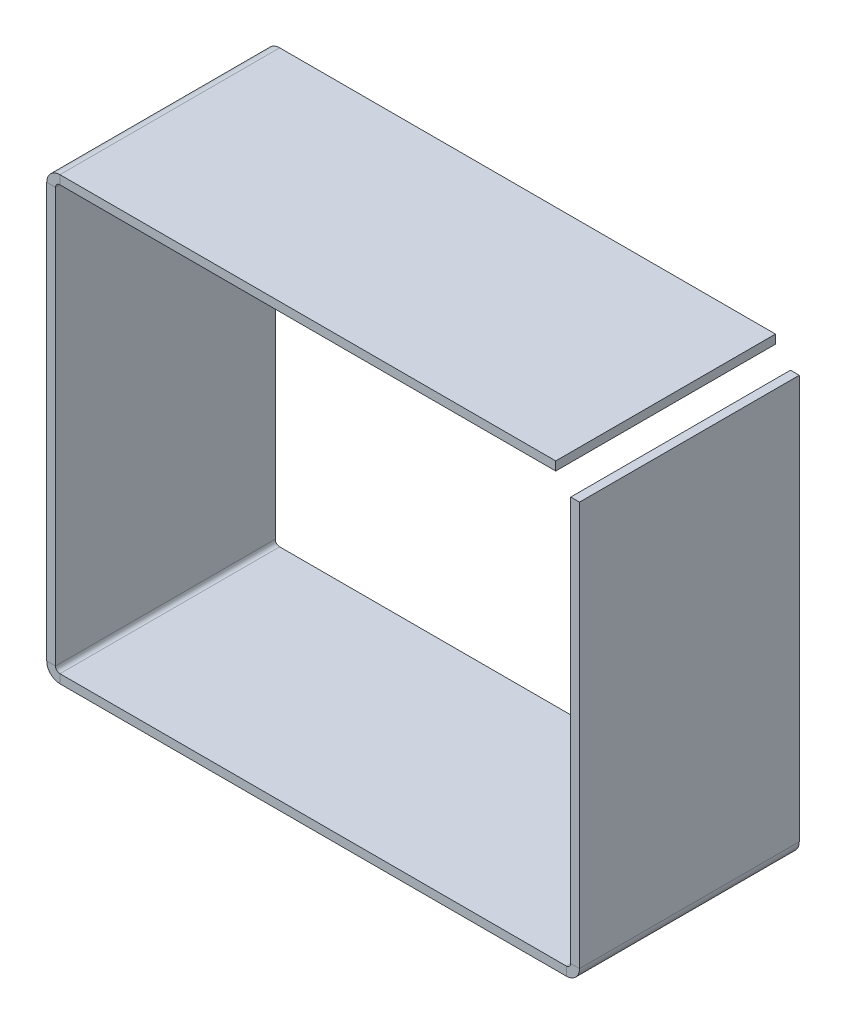
ISO-10303-21;
HEADER;
FILE_DESCRIPTION(('STEP AP214'),'2;1');
FILE_NAME('part.step','',(''),(''),'','','');
FILE_SCHEMA(('AUTOMOTIVE_DESIGN { 1 0 10303 214 1 1 1 1 }'));
ENDSEC;
DATA;
#1=APPLICATION_CONTEXT('core data for automotive mechanical design processes');
#2=APPLICATION_PROTOCOL_DEFINITION('international standard','automotive_design',2000,#1);
#3=PRODUCT_CONTEXT('',#1,'mechanical');
#4=PRODUCT('Part','Part','',(#3));
#5=PRODUCT_RELATED_PRODUCT_CATEGORY('part','',(#4));
#6=PRODUCT_DEFINITION_FORMATION('','',#4);
#7=PRODUCT_DEFINITION_CONTEXT('part definition',#1,'design');
#8=PRODUCT_DEFINITION('design','',#6,#7);
#9=PRODUCT_DEFINITION_SHAPE('','',#8);
#10=(LENGTH_UNIT() NAMED_UNIT(*) SI_UNIT(.MILLI.,.METRE.));
#11=(NAMED_UNIT(*) PLANE_ANGLE_UNIT() SI_UNIT($,.RADIAN.));
#12=(NAMED_UNIT(*) SI_UNIT($,.STERADIAN.) SOLID_ANGLE_UNIT());
#13=UNCERTAINTY_MEASURE_WITH_UNIT(LENGTH_MEASURE(1.E-05),#10,'distance_accuracy_value','');
#14=(GEOMETRIC_REPRESENTATION_CONTEXT(3) GLOBAL_UNCERTAINTY_ASSIGNED_CONTEXT((#13)) GLOBAL_UNIT_ASSIGNED_CONTEXT((#10,
#11,#12)) REPRESENTATION_CONTEXT('',''));
#15=CARTESIAN_POINT('',(0.,0.,0.));
#16=DIRECTION('',(0.,0.,1.));
#17=DIRECTION('',(1.,0.,0.));
#18=AXIS2_PLACEMENT_3D('',#15,#16,#17);
#19=CARTESIAN_POINT('',(-55.4289083851151,46.0431826841211,50.));
#20=DIRECTION('',(0.,0.,-1.));
#21=DIRECTION('',(0.,-1.,0.));
#22=AXIS2_PLACEMENT_3D('',#19,#20,#21);
#23=PLANE('',#22);
#24=DIRECTION('',(1.,0.,0.));
#25=VECTOR('',#24,1.);
#26=CARTESIAN_POINT('',(-55.4289083851151,45.0431826841211,50.));
#27=LINE('',#26,#25);
#28=CARTESIAN_POINT('',(-57.4289083851151,45.0431826841211,50.));
#29=VERTEX_POINT('',#28);
#30=CARTESIAN_POINT('',(-55.4289083851151,45.0431826841211,50.));
#31=VERTEX_POINT('',#30);
#32=EDGE_CURVE('E11',#29,#31,#27,.T.);
#33=ORIENTED_EDGE('',*,*,#32,.F.);
#34=DIRECTION('',(0.,1.,0.));
#35=VECTOR('',#34,1.);
#36=CARTESIAN_POINT('',(-57.4289083851151,46.0431826841211,50.));
#37=LINE('',#36,#35);
#38=CARTESIAN_POINT('',(-57.4289083851151,-49.2933226241939,50.));
#39=VERTEX_POINT('',#38);
#40=EDGE_CURVE('E114',#29,#39,#37,.F.);
#41=ORIENTED_EDGE('',*,*,#40,.T.);
#42=DIRECTION('',(1.,0.,0.));
#43=VECTOR('',#42,1.);
#44=CARTESIAN_POINT('',(-55.4289083851151,-49.2933226241939,50.));
#45=LINE('',#44,#43);
#46=CARTESIAN_POINT('',(-55.4289083851151,-49.2933226241939,50.));
#47=VERTEX_POINT('',#46);
#48=EDGE_CURVE('E50',#39,#47,#45,.T.);
#49=ORIENTED_EDGE('',*,*,#48,.T.);
#50=DIRECTION('',(0.,-1.,0.));
#51=VECTOR('',#50,1.);
#52=CARTESIAN_POINT('',(-55.4289083851151,46.0431826841211,50.));
#53=LINE('',#52,#51);
#54=EDGE_CURVE('E117',#31,#47,#53,.T.);
#55=ORIENTED_EDGE('',*,*,#54,.F.);
#56=EDGE_LOOP('',(#33,#41,#49,#55));
#57=FACE_BOUND('',#56,.T.);
#58=ADVANCED_FACE('F40',(#57),#23,.F.);
#59=CARTESIAN_POINT('',(-54.4289083851151,-49.2933226241939,50.));
#60=DIRECTION('',(0.,0.,1.));
#61=DIRECTION('',(1.,0.,0.));
#62=AXIS2_PLACEMENT_3D('',#59,#60,#61);
#63=PLANE('',#62);
#64=ORIENTED_EDGE('',*,*,#48,.F.);
#65=CARTESIAN_POINT('',(-54.4289083851151,-49.2933226241939,50.));
#66=DIRECTION('',(0.,0.,-1.));
#67=DIRECTION('',(-1.,0.,0.));
#68=AXIS2_PLACEMENT_3D('',#65,#66,#67);
#69=CIRCLE('',#68,3.);
#70=CARTESIAN_POINT('',(-54.4289083851151,-52.2933226241939,50.));
#71=VERTEX_POINT('',#70);
#72=EDGE_CURVE('E156',#39,#71,#69,.F.);
#73=ORIENTED_EDGE('',*,*,#72,.T.);
#74=DIRECTION('',(0.,1.,0.));
#75=VECTOR('',#74,1.);
#76=CARTESIAN_POINT('',(-54.4289083851151,-50.2933226241939,50.));
#77=LINE('',#76,#75);
#78=CARTESIAN_POINT('',(-54.4289083851151,-50.2933226241939,50.));
#79=VERTEX_POINT('',#78);
#80=EDGE_CURVE('E193',#71,#79,#77,.T.);
#81=ORIENTED_EDGE('',*,*,#80,.T.);
#82=CARTESIAN_POINT('',(-54.4289083851151,-49.2933226241939,50.));
#83=DIRECTION('',(0.,0.,-1.));
#84=DIRECTION('',(-1.,0.,0.));
#85=AXIS2_PLACEMENT_3D('',#82,#83,#84);
#86=CIRCLE('',#85,1.);
#87=EDGE_CURVE('E215',#47,#79,#86,.F.);
#88=ORIENTED_EDGE('',*,*,#87,.F.);
#89=EDGE_LOOP('',(#64,#73,#81,#88));
#90=FACE_BOUND('',#89,.T.);
#91=ADVANCED_FACE('F216',(#90),#63,.T.);
#92=CARTESIAN_POINT('',(-55.4289083851151,-50.2933226241939,50.));
#93=DIRECTION('',(0.,0.,-1.));
#94=DIRECTION('',(1.,0.,0.));
#95=AXIS2_PLACEMENT_3D('',#92,#93,#94);
#96=PLANE('',#95);
#97=ORIENTED_EDGE('',*,*,#80,.F.);
#98=DIRECTION('',(1.,0.,0.));
#99=VECTOR('',#98,1.);
#100=CARTESIAN_POINT('',(-55.4289083851151,-52.2933226241939,50.));
#101=LINE('',#100,#99);
#102=CARTESIAN_POINT('',(60.8041182952241,-52.2933226241939,50.));
#103=VERTEX_POINT('',#102);
#104=EDGE_CURVE('E153',#71,#103,#101,.T.);
#105=ORIENTED_EDGE('',*,*,#104,.T.);
#106=DIRECTION('',(0.,1.,0.));
#107=VECTOR('',#106,1.);
#108=CARTESIAN_POINT('',(60.8041182952241,-50.2933226241939,50.));
#109=LINE('',#108,#107);
#110=CARTESIAN_POINT('',(60.8041182952241,-50.2933226241939,50.));
#111=VERTEX_POINT('',#110);
#112=EDGE_CURVE('E58',#103,#111,#109,.T.);
#113=ORIENTED_EDGE('',*,*,#112,.T.);
#114=DIRECTION('',(1.,0.,0.));
#115=VECTOR('',#114,1.);
#116=CARTESIAN_POINT('',(-55.4289083851151,-50.2933226241939,50.));
#117=LINE('',#116,#115);
#118=EDGE_CURVE('E294',#79,#111,#117,.T.);
#119=ORIENTED_EDGE('',*,*,#118,.F.);
#120=EDGE_LOOP('',(#97,#105,#113,#119));
#121=FACE_BOUND('',#120,.T.);
#122=ADVANCED_FACE('F293',(#121),#96,.F.);
#123=CARTESIAN_POINT('',(60.8041182952241,-49.2933226241939,50.));
#124=DIRECTION('',(0.,0.,1.));
#125=DIRECTION('',(1.,0.,0.));
#126=AXIS2_PLACEMENT_3D('',#123,#124,#125);
#127=PLANE('',#126);
#128=ORIENTED_EDGE('',*,*,#112,.F.);
#129=CARTESIAN_POINT('',(60.8041182952241,-49.2933226241939,50.));
#130=DIRECTION('',(0.,0.,-1.));
#131=DIRECTION('',(-1.,0.,0.));
#132=AXIS2_PLACEMENT_3D('',#129,#130,#131);
#133=CIRCLE('',#132,3.);
#134=CARTESIAN_POINT('',(63.8041182952241,-49.2933226241939,50.));
#135=VERTEX_POINT('',#134);
#136=EDGE_CURVE('E274',#103,#135,#133,.F.);
#137=ORIENTED_EDGE('',*,*,#136,.T.);
#138=DIRECTION('',(-1.,0.,0.));
#139=VECTOR('',#138,1.);
#140=CARTESIAN_POINT('',(61.8041182952241,-49.2933226241939,50.));
#141=LINE('',#140,#139);
#142=CARTESIAN_POINT('',(61.8041182952241,-49.2933226241939,50.));
#143=VERTEX_POINT('',#142);
#144=EDGE_CURVE('E189',#135,#143,#141,.T.);
#145=ORIENTED_EDGE('',*,*,#144,.T.);
#146=CARTESIAN_POINT('',(60.8041182952241,-49.2933226241939,50.));
#147=DIRECTION('',(0.,0.,-1.));
#148=DIRECTION('',(-1.,0.,0.));
#149=AXIS2_PLACEMENT_3D('',#146,#147,#148);
#150=CIRCLE('',#149,1.);
#151=EDGE_CURVE('E242',#111,#143,#150,.F.);
#152=ORIENTED_EDGE('',*,*,#151,.F.);
#153=EDGE_LOOP('',(#128,#137,#145,#152));
#154=FACE_BOUND('',#153,.T.);
#155=ADVANCED_FACE('F408',(#154),#127,.T.);
#156=CARTESIAN_POINT('',(61.8041182952241,46.0431826841211,50.));
#157=DIRECTION('',(0.,0.,-1.));
#158=DIRECTION('',(0.,1.,0.));
#159=AXIS2_PLACEMENT_3D('',#156,#157,#158);
#160=PLANE('',#159);
#161=ORIENTED_EDGE('',*,*,#144,.F.);
#162=DIRECTION('',(0.,1.,0.));
#163=VECTOR('',#162,1.);
#164=CARTESIAN_POINT('',(63.8041182952241,46.0431826841211,50.));
#165=LINE('',#164,#163);
#166=CARTESIAN_POINT('',(63.8041182952241,42.628969121748,50.));
#167=VERTEX_POINT('',#166);
#168=EDGE_CURVE('E267',#135,#167,#165,.T.);
#169=ORIENTED_EDGE('',*,*,#168,.T.);
#170=DIRECTION('',(-1.,0.,0.));
#171=VECTOR('',#170,1.);
#172=CARTESIAN_POINT('',(61.8041182952241,42.628969121748,50.));
#173=LINE('',#172,#171);
#174=CARTESIAN_POINT('',(61.8041182952241,42.628969121748,50.));
#175=VERTEX_POINT('',#174);
#176=EDGE_CURVE('E186',#167,#175,#173,.T.);
#177=ORIENTED_EDGE('',*,*,#176,.T.);
#178=DIRECTION('',(0.,1.,0.));
#179=VECTOR('',#178,1.);
#180=CARTESIAN_POINT('',(61.8041182952241,46.0431826841211,50.));
#181=LINE('',#180,#179);
#182=EDGE_CURVE('E328',#143,#175,#181,.T.);
#183=ORIENTED_EDGE('',*,*,#182,.F.);
#184=EDGE_LOOP('',(#161,#169,#177,#183));
#185=FACE_BOUND('',#184,.T.);
#186=ADVANCED_FACE('F337',(#185),#160,.F.);
#187=CARTESIAN_POINT('',(61.8041182952241,42.628969121748,0.));
#188=DIRECTION('',(0.,-1.,0.));
#189=DIRECTION('',(0.,0.,-1.));
#190=AXIS2_PLACEMENT_3D('',#187,#188,#189);
#191=PLANE('',#190);
#192=ORIENTED_EDGE('',*,*,#176,.F.);
#193=DIRECTION('',(0.,0.,-1.));
#194=VECTOR('',#193,1.);
#195=CARTESIAN_POINT('',(63.8041182952241,42.628969121748,0.));
#196=LINE('',#195,#194);
#197=CARTESIAN_POINT('',(63.8041182952241,42.628969121748,0.));
#198=VERTEX_POINT('',#197);
#199=EDGE_CURVE('E138',#167,#198,#196,.T.);
#200=ORIENTED_EDGE('',*,*,#199,.T.);
#201=DIRECTION('',(-1.,0.,0.));
#202=VECTOR('',#201,1.);
#203=CARTESIAN_POINT('',(61.8041182952241,42.628969121748,0.));
#204=LINE('',#203,#202);
#205=CARTESIAN_POINT('',(61.8041182952241,42.628969121748,0.));
#206=VERTEX_POINT('',#205);
#207=EDGE_CURVE('E183',#198,#206,#204,.T.);
#208=ORIENTED_EDGE('',*,*,#207,.T.);
#209=DIRECTION('',(0.,0.,-1.));
#210=VECTOR('',#209,1.);
#211=CARTESIAN_POINT('',(61.8041182952241,42.628969121748,0.));
#212=LINE('',#211,#210);
#213=EDGE_CURVE('E326',#175,#206,#212,.T.);
#214=ORIENTED_EDGE('',*,*,#213,.F.);
#215=EDGE_LOOP('',(#192,#200,#208,#214));
#216=FACE_BOUND('',#215,.T.);
#217=ADVANCED_FACE('F413',(#216),#191,.F.);
#218=CARTESIAN_POINT('',(61.8041182952241,46.0431826841211,0.));
#219=DIRECTION('',(0.,0.,-1.));
#220=DIRECTION('',(0.,1.,0.));
#221=AXIS2_PLACEMENT_3D('',#218,#219,#220);
#222=PLANE('',#221);
#223=ORIENTED_EDGE('',*,*,#207,.F.);
#224=DIRECTION('',(0.,1.,0.));
#225=VECTOR('',#224,1.);
#226=CARTESIAN_POINT('',(63.8041182952241,46.0431826841211,0.));
#227=LINE('',#226,#225);
#228=CARTESIAN_POINT('',(63.8041182952241,-49.2933226241939,0.));
#229=VERTEX_POINT('',#228);
#230=EDGE_CURVE('E261',#229,#198,#227,.T.);
#231=ORIENTED_EDGE('',*,*,#230,.F.);
#232=DIRECTION('',(-1.,0.,0.));
#233=VECTOR('',#232,1.);
#234=CARTESIAN_POINT('',(61.8041182952241,-49.2933226241939,0.));
#235=LINE('',#234,#233);
#236=CARTESIAN_POINT('',(61.8041182952241,-49.2933226241939,0.));
#237=VERTEX_POINT('',#236);
#238=EDGE_CURVE('E180',#229,#237,#235,.T.);
#239=ORIENTED_EDGE('',*,*,#238,.T.);
#240=DIRECTION('',(0.,1.,0.));
#241=VECTOR('',#240,1.);
#242=CARTESIAN_POINT('',(61.8041182952241,46.0431826841211,0.));
#243=LINE('',#242,#241);
#244=EDGE_CURVE('E316',#237,#206,#243,.T.);
#245=ORIENTED_EDGE('',*,*,#244,.T.);
#246=EDGE_LOOP('',(#223,#231,#239,#245));
#247=FACE_BOUND('',#246,.T.);
#248=ADVANCED_FACE('F314',(#247),#222,.T.);
#249=CARTESIAN_POINT('',(60.8041182952241,-49.2933226241939,0.));
#250=DIRECTION('',(0.,0.,-1.));
#251=DIRECTION('',(-1.,0.,0.));
#252=AXIS2_PLACEMENT_3D('',#249,#250,#251);
#253=PLANE('',#252);
#254=ORIENTED_EDGE('',*,*,#238,.F.);
#255=CARTESIAN_POINT('',(60.8041182952241,-49.2933226241939,0.));
#256=DIRECTION('',(0.,0.,-1.));
#257=DIRECTION('',(-1.,0.,0.));
#258=AXIS2_PLACEMENT_3D('',#255,#256,#257);
#259=CIRCLE('',#258,3.);
#260=CARTESIAN_POINT('',(60.8041182952241,-52.2933226241939,0.));
#261=VERTEX_POINT('',#260);
#262=EDGE_CURVE('E271',#229,#261,#259,.T.);
#263=ORIENTED_EDGE('',*,*,#262,.T.);
#264=DIRECTION('',(0.,1.,0.));
#265=VECTOR('',#264,1.);
#266=CARTESIAN_POINT('',(60.8041182952241,-50.2933226241939,0.));
#267=LINE('',#266,#265);
#268=CARTESIAN_POINT('',(60.8041182952241,-50.2933226241939,0.));
#269=VERTEX_POINT('',#268);
#270=EDGE_CURVE('E178',#261,#269,#267,.T.);
#271=ORIENTED_EDGE('',*,*,#270,.T.);
#272=CARTESIAN_POINT('',(60.8041182952241,-49.2933226241939,0.));
#273=DIRECTION('',(0.,0.,1.));
#274=DIRECTION('',(1.,0.,0.));
#275=AXIS2_PLACEMENT_3D('',#272,#273,#274);
#276=CIRCLE('',#275,1.);
#277=EDGE_CURVE('E221',#237,#269,#276,.F.);
#278=ORIENTED_EDGE('',*,*,#277,.F.);
#279=EDGE_LOOP('',(#254,#263,#271,#278));
#280=FACE_BOUND('',#279,.T.);
#281=ADVANCED_FACE('F330',(#280),#253,.T.);
#282=CARTESIAN_POINT('',(-55.4289083851151,-50.2933226241939,0.));
#283=DIRECTION('',(0.,0.,-1.));
#284=DIRECTION('',(1.,0.,0.));
#285=AXIS2_PLACEMENT_3D('',#282,#283,#284);
#286=PLANE('',#285);
#287=ORIENTED_EDGE('',*,*,#270,.F.);
#288=DIRECTION('',(1.,0.,0.));
#289=VECTOR('',#288,1.);
#290=CARTESIAN_POINT('',(-55.4289083851151,-52.2933226241939,0.));
#291=LINE('',#290,#289);
#292=CARTESIAN_POINT('',(-54.4289083851151,-52.2933226241939,0.));
#293=VERTEX_POINT('',#292);
#294=EDGE_CURVE('E146',#293,#261,#291,.T.);
#295=ORIENTED_EDGE('',*,*,#294,.F.);
#296=DIRECTION('',(0.,1.,0.));
#297=VECTOR('',#296,1.);
#298=CARTESIAN_POINT('',(-54.4289083851151,-50.2933226241939,0.));
#299=LINE('',#298,#297);
#300=CARTESIAN_POINT('',(-54.4289083851151,-50.2933226241939,0.));
#301=VERTEX_POINT('',#300);
#302=EDGE_CURVE('E175',#293,#301,#299,.T.);
#303=ORIENTED_EDGE('',*,*,#302,.T.);
#304=DIRECTION('',(1.,0.,0.));
#305=VECTOR('',#304,1.);
#306=CARTESIAN_POINT('',(-55.4289083851151,-50.2933226241939,0.));
#307=LINE('',#306,#305);
#308=EDGE_CURVE('E212',#301,#269,#307,.T.);
#309=ORIENTED_EDGE('',*,*,#308,.T.);
#310=EDGE_LOOP('',(#287,#295,#303,#309));
#311=FACE_BOUND('',#310,.T.);
#312=ADVANCED_FACE('F392',(#311),#286,.T.);
#313=CARTESIAN_POINT('',(-54.4289083851151,-49.2933226241939,0.));
#314=DIRECTION('',(0.,0.,-1.));
#315=DIRECTION('',(-1.,0.,0.));
#316=AXIS2_PLACEMENT_3D('',#313,#314,#315);
#317=PLANE('',#316);
#318=ORIENTED_EDGE('',*,*,#302,.F.);
#319=CARTESIAN_POINT('',(-54.4289083851151,-49.2933226241939,0.));
#320=DIRECTION('',(0.,0.,-1.));
#321=DIRECTION('',(-1.,0.,0.));
#322=AXIS2_PLACEMENT_3D('',#319,#320,#321);
#323=CIRCLE('',#322,3.);
#324=CARTESIAN_POINT('',(-57.4289083851151,-49.2933226241939,0.));
#325=VERTEX_POINT('',#324);
#326=EDGE_CURVE('E151',#293,#325,#323,.T.);
#327=ORIENTED_EDGE('',*,*,#326,.T.);
#328=DIRECTION('',(1.,0.,0.));
#329=VECTOR('',#328,1.);
#330=CARTESIAN_POINT('',(-55.4289083851151,-49.2933226241939,0.));
#331=LINE('',#330,#329);
#332=CARTESIAN_POINT('',(-55.4289083851151,-49.2933226241939,0.));
#333=VERTEX_POINT('',#332);
#334=EDGE_CURVE('E172',#325,#333,#331,.T.);
#335=ORIENTED_EDGE('',*,*,#334,.T.);
#336=CARTESIAN_POINT('',(-54.4289083851151,-49.2933226241939,0.));
#337=DIRECTION('',(0.,0.,1.));
#338=DIRECTION('',(1.,0.,0.));
#339=AXIS2_PLACEMENT_3D('',#336,#337,#338);
#340=CIRCLE('',#339,1.);
#341=EDGE_CURVE('E220',#301,#333,#340,.F.);
#342=ORIENTED_EDGE('',*,*,#341,.F.);
#343=EDGE_LOOP('',(#318,#327,#335,#342));
#344=FACE_BOUND('',#343,.T.);
#345=ADVANCED_FACE('F390',(#344),#317,.T.);
#346=CARTESIAN_POINT('',(-55.4289083851151,46.0431826841211,0.));
#347=DIRECTION('',(0.,0.,-1.));
#348=DIRECTION('',(0.,-1.,0.));
#349=AXIS2_PLACEMENT_3D('',#346,#347,#348);
#350=PLANE('',#349);
#351=ORIENTED_EDGE('',*,*,#334,.F.);
#352=DIRECTION('',(0.,1.,0.));
#353=VECTOR('',#352,1.);
#354=CARTESIAN_POINT('',(-57.4289083851151,46.0431826841211,0.));
#355=LINE('',#354,#353);
#356=CARTESIAN_POINT('',(-57.4289083851151,45.0431826841211,0.));
#357=VERTEX_POINT('',#356);
#358=EDGE_CURVE('E145',#357,#325,#355,.F.);
#359=ORIENTED_EDGE('',*,*,#358,.F.);
#360=DIRECTION('',(1.,0.,0.));
#361=VECTOR('',#360,1.);
#362=CARTESIAN_POINT('',(-55.4289083851151,45.0431826841211,0.));
#363=LINE('',#362,#361);
#364=CARTESIAN_POINT('',(-55.4289083851151,45.0431826841211,0.));
#365=VERTEX_POINT('',#364);
#366=EDGE_CURVE('E169',#357,#365,#363,.T.);
#367=ORIENTED_EDGE('',*,*,#366,.T.);
#368=DIRECTION('',(0.,-1.,0.));
#369=VECTOR('',#368,1.);
#370=CARTESIAN_POINT('',(-55.4289083851151,46.0431826841211,0.));
#371=LINE('',#370,#369);
#372=EDGE_CURVE('E211',#365,#333,#371,.T.);
#373=ORIENTED_EDGE('',*,*,#372,.T.);
#374=EDGE_LOOP('',(#351,#359,#367,#373));
#375=FACE_BOUND('',#374,.T.);
#376=ADVANCED_FACE('F388',(#375),#350,.T.);
#377=CARTESIAN_POINT('',(-54.4289083851151,45.0431826841211,0.));
#378=DIRECTION('',(0.,0.,-1.));
#379=DIRECTION('',(-1.,0.,0.));
#380=AXIS2_PLACEMENT_3D('',#377,#378,#379);
#381=PLANE('',#380);
#382=ORIENTED_EDGE('',*,*,#366,.F.);
#383=CARTESIAN_POINT('',(-54.4289083851151,45.0431826841211,0.));
#384=DIRECTION('',(0.,0.,-1.));
#385=DIRECTION('',(-1.,0.,0.));
#386=AXIS2_PLACEMENT_3D('',#383,#384,#385);
#387=CIRCLE('',#386,3.);
#388=CARTESIAN_POINT('',(-54.4289083851151,48.0431826841211,0.));
#389=VERTEX_POINT('',#388);
#390=EDGE_CURVE('E133',#357,#389,#387,.T.);
#391=ORIENTED_EDGE('',*,*,#390,.T.);
#392=DIRECTION('',(0.,-1.,0.));
#393=VECTOR('',#392,1.);
#394=CARTESIAN_POINT('',(-54.4289083851151,46.0431826841211,0.));
#395=LINE('',#394,#393);
#396=CARTESIAN_POINT('',(-54.4289083851151,46.0431826841211,0.));
#397=VERTEX_POINT('',#396);
#398=EDGE_CURVE('E166',#389,#397,#395,.T.);
#399=ORIENTED_EDGE('',*,*,#398,.T.);
#400=CARTESIAN_POINT('',(-54.4289083851151,45.0431826841211,0.));
#401=DIRECTION('',(0.,0.,1.));
#402=DIRECTION('',(1.,0.,0.));
#403=AXIS2_PLACEMENT_3D('',#400,#401,#402);
#404=CIRCLE('',#403,1.);
#405=EDGE_CURVE('E300',#365,#397,#404,.F.);
#406=ORIENTED_EDGE('',*,*,#405,.F.);
#407=EDGE_LOOP('',(#382,#391,#399,#406));
#408=FACE_BOUND('',#407,.T.);
#409=ADVANCED_FACE('F386',(#408),#381,.T.);
#410=CARTESIAN_POINT('',(-55.4289083851151,46.0431826841211,0.));
#411=DIRECTION('',(0.,0.,-1.));
#412=DIRECTION('',(-1.,0.,0.));
#413=AXIS2_PLACEMENT_3D('',#410,#411,#412);
#414=PLANE('',#413);
#415=ORIENTED_EDGE('',*,*,#398,.F.);
#416=DIRECTION('',(1.,0.,0.));
#417=VECTOR('',#416,1.);
#418=CARTESIAN_POINT('',(-55.4289083851151,48.0431826841211,0.));
#419=LINE('',#418,#417);
#420=CARTESIAN_POINT('',(58.389904732851,48.0431826841211,0.));
#421=VERTEX_POINT('',#420);
#422=EDGE_CURVE('E260',#421,#389,#419,.F.);
#423=ORIENTED_EDGE('',*,*,#422,.F.);
#424=DIRECTION('',(0.,-1.,0.));
#425=VECTOR('',#424,1.);
#426=CARTESIAN_POINT('',(58.389904732851,46.0431826841211,0.));
#427=LINE('',#426,#425);
#428=CARTESIAN_POINT('',(58.389904732851,46.0431826841211,0.));
#429=VERTEX_POINT('',#428);
#430=EDGE_CURVE('E163',#421,#429,#427,.T.);
#431=ORIENTED_EDGE('',*,*,#430,.T.);
#432=DIRECTION('',(-1.,0.,0.));
#433=VECTOR('',#432,1.);
#434=CARTESIAN_POINT('',(-55.4289083851151,46.0431826841211,0.));
#435=LINE('',#434,#433);
#436=EDGE_CURVE('E344',#429,#397,#435,.T.);
#437=ORIENTED_EDGE('',*,*,#436,.T.);
#438=EDGE_LOOP('',(#415,#423,#431,#437));
#439=FACE_BOUND('',#438,.T.);
#440=ADVANCED_FACE('F365',(#439),#414,.T.);
#441=CARTESIAN_POINT('',(58.389904732851,46.0431826841211,50.));
#442=DIRECTION('',(-1.,0.,0.));
#443=DIRECTION('',(0.,0.,1.));
#444=AXIS2_PLACEMENT_3D('',#441,#442,#443);
#445=PLANE('',#444);
#446=ORIENTED_EDGE('',*,*,#430,.F.);
#447=DIRECTION('',(0.,0.,1.));
#448=VECTOR('',#447,1.);
#449=CARTESIAN_POINT('',(58.389904732851,48.0431826841211,0.));
#450=LINE('',#449,#448);
#451=CARTESIAN_POINT('',(58.389904732851,48.0431826841211,50.));
#452=VERTEX_POINT('',#451);
#453=EDGE_CURVE('E262',#421,#452,#450,.T.);
#454=ORIENTED_EDGE('',*,*,#453,.T.);
#455=DIRECTION('',(0.,-1.,0.));
#456=VECTOR('',#455,1.);
#457=CARTESIAN_POINT('',(58.389904732851,46.0431826841211,50.));
#458=LINE('',#457,#456);
#459=CARTESIAN_POINT('',(58.389904732851,46.0431826841211,50.));
#460=VERTEX_POINT('',#459);
#461=EDGE_CURVE('E160',#452,#460,#458,.T.);
#462=ORIENTED_EDGE('',*,*,#461,.T.);
#463=DIRECTION('',(0.,0.,1.));
#464=VECTOR('',#463,1.);
#465=CARTESIAN_POINT('',(58.389904732851,46.0431826841211,50.));
#466=LINE('',#465,#464);
#467=EDGE_CURVE('E347',#429,#460,#466,.T.);
#468=ORIENTED_EDGE('',*,*,#467,.F.);
#469=EDGE_LOOP('',(#446,#454,#462,#468));
#470=FACE_BOUND('',#469,.T.);
#471=ADVANCED_FACE('F380',(#470),#445,.F.);
#472=CARTESIAN_POINT('',(-55.4289083851151,46.0431826841211,50.));
#473=DIRECTION('',(0.,0.,-1.));
#474=DIRECTION('',(-1.,0.,0.));
#475=AXIS2_PLACEMENT_3D('',#472,#473,#474);
#476=PLANE('',#475);
#477=ORIENTED_EDGE('',*,*,#461,.F.);
#478=DIRECTION('',(1.,0.,0.));
#479=VECTOR('',#478,1.);
#480=CARTESIAN_POINT('',(-55.4289083851151,48.0431826841211,50.));
#481=LINE('',#480,#479);
#482=CARTESIAN_POINT('',(-54.4289083851151,48.0431826841211,50.));
#483=VERTEX_POINT('',#482);
#484=EDGE_CURVE('E258',#452,#483,#481,.F.);
#485=ORIENTED_EDGE('',*,*,#484,.T.);
#486=DIRECTION('',(0.,-1.,0.));
#487=VECTOR('',#486,1.);
#488=CARTESIAN_POINT('',(-54.4289083851151,46.0431826841211,50.));
#489=LINE('',#488,#487);
#490=CARTESIAN_POINT('',(-54.4289083851151,46.0431826841211,50.));
#491=VERTEX_POINT('',#490);
#492=EDGE_CURVE('E44',#483,#491,#489,.T.);
#493=ORIENTED_EDGE('',*,*,#492,.T.);
#494=DIRECTION('',(-1.,0.,0.));
#495=VECTOR('',#494,1.);
#496=CARTESIAN_POINT('',(-55.4289083851151,46.0431826841211,50.));
#497=LINE('',#496,#495);
#498=EDGE_CURVE('E327',#460,#491,#497,.T.);
#499=ORIENTED_EDGE('',*,*,#498,.F.);
#500=EDGE_LOOP('',(#477,#485,#493,#499));
#501=FACE_BOUND('',#500,.T.);
#502=ADVANCED_FACE('F383',(#501),#476,.F.);
#503=CARTESIAN_POINT('',(-54.4289083851151,45.0431826841211,50.));
#504=DIRECTION('',(0.,0.,1.));
#505=DIRECTION('',(1.,0.,0.));
#506=AXIS2_PLACEMENT_3D('',#503,#504,#505);
#507=PLANE('',#506);
#508=CARTESIAN_POINT('',(-54.4289083851151,45.0431826841211,50.));
#509=DIRECTION('',(0.,0.,-1.));
#510=DIRECTION('',(-1.,0.,0.));
#511=AXIS2_PLACEMENT_3D('',#508,#509,#510);
#512=CIRCLE('',#511,3.);
#513=EDGE_CURVE('E130',#483,#29,#512,.F.);
#514=ORIENTED_EDGE('',*,*,#513,.T.);
#515=ORIENTED_EDGE('',*,*,#32,.T.);
#516=CARTESIAN_POINT('',(-54.4289083851151,45.0431826841211,50.));
#517=DIRECTION('',(0.,0.,-1.));
#518=DIRECTION('',(-1.,0.,0.));
#519=AXIS2_PLACEMENT_3D('',#516,#517,#518);
#520=CIRCLE('',#519,1.);
#521=EDGE_CURVE('E238',#491,#31,#520,.F.);
#522=ORIENTED_EDGE('',*,*,#521,.F.);
#523=ORIENTED_EDGE('',*,*,#492,.F.);
#524=EDGE_LOOP('',(#514,#515,#522,#523));
#525=FACE_BOUND('',#524,.T.);
#526=ADVANCED_FACE('F42',(#525),#507,.T.);
#527=CARTESIAN_POINT('',(-55.4289083851151,46.0431826841211,0.));
#528=DIRECTION('',(0.,1.,0.));
#529=DIRECTION('',(0.,0.,1.));
#530=AXIS2_PLACEMENT_3D('',#527,#528,#529);
#531=PLANE('',#530);
#532=ORIENTED_EDGE('',*,*,#498,.T.);
#533=DIRECTION('',(0.,0.,1.));
#534=VECTOR('',#533,1.);
#535=CARTESIAN_POINT('',(-54.4289083851151,46.0431826841211,0.));
#536=LINE('',#535,#534);
#537=EDGE_CURVE('E234',#491,#397,#536,.F.);
#538=ORIENTED_EDGE('',*,*,#537,.T.);
#539=ORIENTED_EDGE('',*,*,#436,.F.);
#540=ORIENTED_EDGE('',*,*,#467,.T.);
#541=EDGE_LOOP('',(#532,#538,#539,#540));
#542=FACE_BOUND('',#541,.T.);
#543=ADVANCED_FACE('F370',(#542),#531,.F.);
#544=CARTESIAN_POINT('',(61.8041182952241,46.0431826841211,0.));
#545=DIRECTION('',(1.,0.,0.));
#546=DIRECTION('',(0.,0.,-1.));
#547=AXIS2_PLACEMENT_3D('',#544,#545,#546);
#548=PLANE('',#547);
#549=ORIENTED_EDGE('',*,*,#244,.F.);
#550=DIRECTION('',(0.,0.,1.));
#551=VECTOR('',#550,1.);
#552=CARTESIAN_POINT('',(61.8041182952241,-49.2933226241939,50.));
#553=LINE('',#552,#551);
#554=EDGE_CURVE('E227',#237,#143,#553,.T.);
#555=ORIENTED_EDGE('',*,*,#554,.T.);
#556=ORIENTED_EDGE('',*,*,#182,.T.);
#557=ORIENTED_EDGE('',*,*,#213,.T.);
#558=EDGE_LOOP('',(#549,#555,#556,#557));
#559=FACE_BOUND('',#558,.T.);
#560=ADVANCED_FACE('F322',(#559),#548,.F.);
#561=CARTESIAN_POINT('',(-55.4289083851151,46.0431826841211,0.));
#562=DIRECTION('',(-1.,0.,0.));
#563=DIRECTION('',(0.,0.,1.));
#564=AXIS2_PLACEMENT_3D('',#561,#562,#563);
#565=PLANE('',#564);
#566=ORIENTED_EDGE('',*,*,#54,.T.);
#567=DIRECTION('',(0.,0.,1.));
#568=VECTOR('',#567,1.);
#569=CARTESIAN_POINT('',(-55.4289083851151,-49.2933226241939,0.));
#570=LINE('',#569,#568);
#571=EDGE_CURVE('E208',#47,#333,#570,.F.);
#572=ORIENTED_EDGE('',*,*,#571,.T.);
#573=ORIENTED_EDGE('',*,*,#372,.F.);
#574=DIRECTION('',(0.,0.,1.));
#575=VECTOR('',#574,1.);
#576=CARTESIAN_POINT('',(-55.4289083851151,45.0431826841211,50.));
#577=LINE('',#576,#575);
#578=EDGE_CURVE('E210',#365,#31,#577,.T.);
#579=ORIENTED_EDGE('',*,*,#578,.T.);
#580=EDGE_LOOP('',(#566,#572,#573,#579));
#581=FACE_BOUND('',#580,.T.);
#582=ADVANCED_FACE('F205',(#581),#565,.F.);
#583=CARTESIAN_POINT('',(-55.4289083851151,-50.2933226241939,0.));
#584=DIRECTION('',(0.,-1.,0.));
#585=DIRECTION('',(0.,0.,-1.));
#586=AXIS2_PLACEMENT_3D('',#583,#584,#585);
#587=PLANE('',#586);
#588=ORIENTED_EDGE('',*,*,#118,.T.);
#589=DIRECTION('',(0.,0.,1.));
#590=VECTOR('',#589,1.);
#591=CARTESIAN_POINT('',(60.8041182952241,-50.2933226241939,0.));
#592=LINE('',#591,#590);
#593=EDGE_CURVE('E231',#111,#269,#592,.F.);
#594=ORIENTED_EDGE('',*,*,#593,.T.);
#595=ORIENTED_EDGE('',*,*,#308,.F.);
#596=DIRECTION('',(0.,0.,1.));
#597=VECTOR('',#596,1.);
#598=CARTESIAN_POINT('',(-54.4289083851151,-50.2933226241939,50.));
#599=LINE('',#598,#597);
#600=EDGE_CURVE('E228',#301,#79,#599,.T.);
#601=ORIENTED_EDGE('',*,*,#600,.T.);
#602=EDGE_LOOP('',(#588,#594,#595,#601));
#603=FACE_BOUND('',#602,.T.);
#604=ADVANCED_FACE('F303',(#603),#587,.F.);
#605=CARTESIAN_POINT('',(-54.4289083851151,45.0431826841211,0.));
#606=DIRECTION('',(0.,0.,-1.));
#607=DIRECTION('',(-1.,0.,0.));
#608=AXIS2_PLACEMENT_3D('',#605,#606,#607);
#609=CYLINDRICAL_SURFACE('',#608,1.);
#610=ORIENTED_EDGE('',*,*,#405,.T.);
#611=ORIENTED_EDGE('',*,*,#537,.F.);
#612=ORIENTED_EDGE('',*,*,#521,.T.);
#613=ORIENTED_EDGE('',*,*,#578,.F.);
#614=EDGE_LOOP('',(#610,#611,#612,#613));
#615=FACE_BOUND('',#614,.T.);
#616=ADVANCED_FACE('F359',(#615),#609,.F.);
#617=CARTESIAN_POINT('',(-54.4289083851151,-49.2933226241939,0.));
#618=DIRECTION('',(0.,0.,-1.));
#619=DIRECTION('',(-1.,0.,0.));
#620=AXIS2_PLACEMENT_3D('',#617,#618,#619);
#621=CYLINDRICAL_SURFACE('',#620,1.);
#622=ORIENTED_EDGE('',*,*,#341,.T.);
#623=ORIENTED_EDGE('',*,*,#571,.F.);
#624=ORIENTED_EDGE('',*,*,#87,.T.);
#625=ORIENTED_EDGE('',*,*,#600,.F.);
#626=EDGE_LOOP('',(#622,#623,#624,#625));
#627=FACE_BOUND('',#626,.T.);
#628=ADVANCED_FACE('F224',(#627),#621,.F.);
#629=CARTESIAN_POINT('',(60.8041182952241,-49.2933226241939,0.));
#630=DIRECTION('',(0.,0.,-1.));
#631=DIRECTION('',(-1.,0.,0.));
#632=AXIS2_PLACEMENT_3D('',#629,#630,#631);
#633=CYLINDRICAL_SURFACE('',#632,1.);
#634=ORIENTED_EDGE('',*,*,#277,.T.);
#635=ORIENTED_EDGE('',*,*,#593,.F.);
#636=ORIENTED_EDGE('',*,*,#151,.T.);
#637=ORIENTED_EDGE('',*,*,#554,.F.);
#638=EDGE_LOOP('',(#634,#635,#636,#637));
#639=FACE_BOUND('',#638,.T.);
#640=ADVANCED_FACE('F333',(#639),#633,.F.);
#641=CARTESIAN_POINT('',(-55.4289083851151,48.0431826841211,0.));
#642=DIRECTION('',(0.,1.,0.));
#643=DIRECTION('',(0.,0.,1.));
#644=AXIS2_PLACEMENT_3D('',#641,#642,#643);
#645=PLANE('',#644);
#646=ORIENTED_EDGE('',*,*,#484,.F.);
#647=ORIENTED_EDGE('',*,*,#453,.F.);
#648=ORIENTED_EDGE('',*,*,#422,.T.);
#649=DIRECTION('',(0.,0.,1.));
#650=VECTOR('',#649,1.);
#651=CARTESIAN_POINT('',(-54.4289083851151,48.0431826841211,0.));
#652=LINE('',#651,#650);
#653=EDGE_CURVE('E137',#483,#389,#652,.F.);
#654=ORIENTED_EDGE('',*,*,#653,.F.);
#655=EDGE_LOOP('',(#646,#647,#648,#654));
#656=FACE_BOUND('',#655,.T.);
#657=ADVANCED_FACE('F385',(#656),#645,.T.);
#658=CARTESIAN_POINT('',(63.8041182952241,46.0431826841211,0.));
#659=DIRECTION('',(1.,0.,0.));
#660=DIRECTION('',(0.,0.,-1.));
#661=AXIS2_PLACEMENT_3D('',#658,#659,#660);
#662=PLANE('',#661);
#663=ORIENTED_EDGE('',*,*,#230,.T.);
#664=ORIENTED_EDGE('',*,*,#199,.F.);
#665=ORIENTED_EDGE('',*,*,#168,.F.);
#666=DIRECTION('',(0.,0.,-1.));
#667=VECTOR('',#666,1.);
#668=CARTESIAN_POINT('',(63.8041182952241,-49.2933226241939,0.));
#669=LINE('',#668,#667);
#670=EDGE_CURVE('E251',#229,#135,#669,.F.);
#671=ORIENTED_EDGE('',*,*,#670,.F.);
#672=EDGE_LOOP('',(#663,#664,#665,#671));
#673=FACE_BOUND('',#672,.T.);
#674=ADVANCED_FACE('F558',(#673),#662,.T.);
#675=CARTESIAN_POINT('',(-57.4289083851151,46.0431826841211,0.));
#676=DIRECTION('',(-1.,0.,0.));
#677=DIRECTION('',(0.,0.,1.));
#678=AXIS2_PLACEMENT_3D('',#675,#676,#677);
#679=PLANE('',#678);
#680=ORIENTED_EDGE('',*,*,#40,.F.);
#681=DIRECTION('',(0.,0.,1.));
#682=VECTOR('',#681,1.);
#683=CARTESIAN_POINT('',(-57.4289083851151,45.0431826841211,0.));
#684=LINE('',#683,#682);
#685=EDGE_CURVE('E127',#357,#29,#684,.T.);
#686=ORIENTED_EDGE('',*,*,#685,.F.);
#687=ORIENTED_EDGE('',*,*,#358,.T.);
#688=DIRECTION('',(0.,0.,1.));
#689=VECTOR('',#688,1.);
#690=CARTESIAN_POINT('',(-57.4289083851151,-49.2933226241939,0.));
#691=LINE('',#690,#689);
#692=EDGE_CURVE('E143',#39,#325,#691,.F.);
#693=ORIENTED_EDGE('',*,*,#692,.F.);
#694=EDGE_LOOP('',(#680,#686,#687,#693));
#695=FACE_BOUND('',#694,.T.);
#696=ADVANCED_FACE('F141',(#695),#679,.T.);
#697=CARTESIAN_POINT('',(-55.4289083851151,-52.2933226241939,0.));
#698=DIRECTION('',(0.,-1.,0.));
#699=DIRECTION('',(0.,0.,-1.));
#700=AXIS2_PLACEMENT_3D('',#697,#698,#699);
#701=PLANE('',#700);
#702=ORIENTED_EDGE('',*,*,#104,.F.);
#703=DIRECTION('',(0.,0.,-1.));
#704=VECTOR('',#703,1.);
#705=CARTESIAN_POINT('',(-54.4289083851151,-52.2933226241939,0.));
#706=LINE('',#705,#704);
#707=EDGE_CURVE('E248',#293,#71,#706,.F.);
#708=ORIENTED_EDGE('',*,*,#707,.F.);
#709=ORIENTED_EDGE('',*,*,#294,.T.);
#710=DIRECTION('',(0.,0.,-1.));
#711=VECTOR('',#710,1.);
#712=CARTESIAN_POINT('',(60.8041182952241,-52.2933226241939,0.));
#713=LINE('',#712,#711);
#714=EDGE_CURVE('E245',#103,#261,#713,.T.);
#715=ORIENTED_EDGE('',*,*,#714,.F.);
#716=EDGE_LOOP('',(#702,#708,#709,#715));
#717=FACE_BOUND('',#716,.T.);
#718=ADVANCED_FACE('F291',(#717),#701,.T.);
#719=CARTESIAN_POINT('',(-54.4289083851151,45.0431826841211,0.));
#720=DIRECTION('',(0.,0.,-1.));
#721=DIRECTION('',(-1.,0.,0.));
#722=AXIS2_PLACEMENT_3D('',#719,#720,#721);
#723=CYLINDRICAL_SURFACE('',#722,3.);
#724=ORIENTED_EDGE('',*,*,#390,.F.);
#725=ORIENTED_EDGE('',*,*,#685,.T.);
#726=ORIENTED_EDGE('',*,*,#513,.F.);
#727=ORIENTED_EDGE('',*,*,#653,.T.);
#728=EDGE_LOOP('',(#724,#725,#726,#727));
#729=FACE_BOUND('',#728,.T.);
#730=ADVANCED_FACE('F128',(#729),#723,.T.);
#731=CARTESIAN_POINT('',(-54.4289083851151,-49.2933226241939,0.));
#732=DIRECTION('',(0.,0.,-1.));
#733=DIRECTION('',(-1.,0.,0.));
#734=AXIS2_PLACEMENT_3D('',#731,#732,#733);
#735=CYLINDRICAL_SURFACE('',#734,3.);
#736=ORIENTED_EDGE('',*,*,#326,.F.);
#737=ORIENTED_EDGE('',*,*,#707,.T.);
#738=ORIENTED_EDGE('',*,*,#72,.F.);
#739=ORIENTED_EDGE('',*,*,#692,.T.);
#740=EDGE_LOOP('',(#736,#737,#738,#739));
#741=FACE_BOUND('',#740,.T.);
#742=ADVANCED_FACE('F285',(#741),#735,.T.);
#743=CARTESIAN_POINT('',(60.8041182952241,-49.2933226241939,0.));
#744=DIRECTION('',(0.,0.,-1.));
#745=DIRECTION('',(-1.,0.,0.));
#746=AXIS2_PLACEMENT_3D('',#743,#744,#745);
#747=CYLINDRICAL_SURFACE('',#746,3.);
#748=ORIENTED_EDGE('',*,*,#262,.F.);
#749=ORIENTED_EDGE('',*,*,#670,.T.);
#750=ORIENTED_EDGE('',*,*,#136,.F.);
#751=ORIENTED_EDGE('',*,*,#714,.T.);
#752=EDGE_LOOP('',(#748,#749,#750,#751));
#753=FACE_BOUND('',#752,.T.);
#754=ADVANCED_FACE('F605',(#753),#747,.T.);
#755=CLOSED_SHELL('',(#58,#91,#122,#155,#186,#217,#248,#281,#312,#345,#376,#409,#440,#471,#502,
#526,#543,#560,#582,#604,#616,#628,#640,#657,#674,#696,#718,#730,#742,#754));
#756=MANIFOLD_SOLID_BREP('B2',#755);
#757=ADVANCED_BREP_SHAPE_REPRESENTATION('',(#18,#756),#14);
#758=SHAPE_DEFINITION_REPRESENTATION(#9,#757);
ENDSEC;
END-ISO-10303-21;
